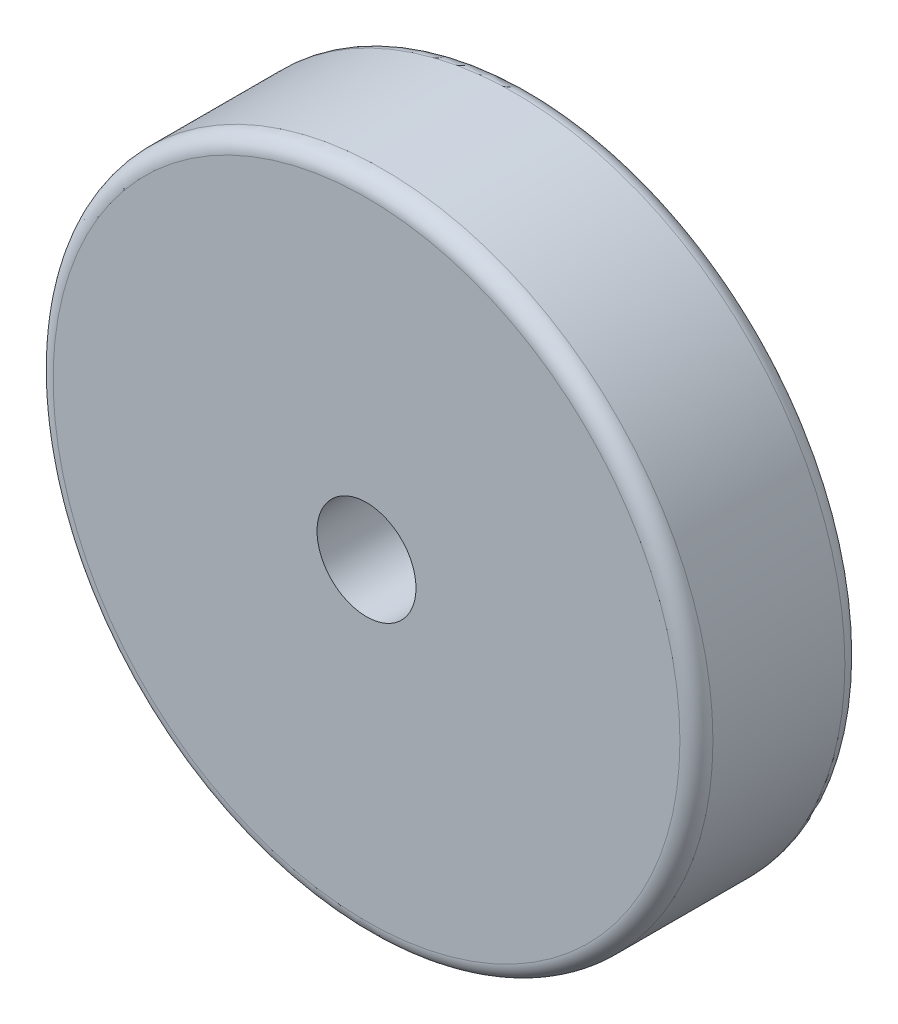
ISO-10303-21;
HEADER;
FILE_DESCRIPTION(('STEP AP214'),'2;1');
FILE_NAME('part.step','',(''),(''),'','','');
FILE_SCHEMA(('AUTOMOTIVE_DESIGN { 1 0 10303 214 1 1 1 1 }'));
ENDSEC;
DATA;
#1=APPLICATION_CONTEXT('core data for automotive mechanical design processes');
#2=APPLICATION_PROTOCOL_DEFINITION('international standard','automotive_design',2000,#1);
#3=PRODUCT_CONTEXT('',#1,'mechanical');
#4=PRODUCT('Part','Part','',(#3));
#5=PRODUCT_RELATED_PRODUCT_CATEGORY('part','',(#4));
#6=PRODUCT_DEFINITION_FORMATION('','',#4);
#7=PRODUCT_DEFINITION_CONTEXT('part definition',#1,'design');
#8=PRODUCT_DEFINITION('design','',#6,#7);
#9=PRODUCT_DEFINITION_SHAPE('','',#8);
#10=(LENGTH_UNIT() NAMED_UNIT(*) SI_UNIT(.MILLI.,.METRE.));
#11=(NAMED_UNIT(*) PLANE_ANGLE_UNIT() SI_UNIT($,.RADIAN.));
#12=(NAMED_UNIT(*) SI_UNIT($,.STERADIAN.) SOLID_ANGLE_UNIT());
#13=UNCERTAINTY_MEASURE_WITH_UNIT(LENGTH_MEASURE(1.E-05),#10,'distance_accuracy_value','');
#14=(GEOMETRIC_REPRESENTATION_CONTEXT(3) GLOBAL_UNCERTAINTY_ASSIGNED_CONTEXT((#13)) GLOBAL_UNIT_ASSIGNED_CONTEXT((#10,
#11,#12)) REPRESENTATION_CONTEXT('',''));
#15=CARTESIAN_POINT('',(0.,0.,0.));
#16=DIRECTION('',(0.,0.,1.));
#17=DIRECTION('',(1.,0.,0.));
#18=AXIS2_PLACEMENT_3D('',#15,#16,#17);
#19=CARTESIAN_POINT('',(0.,0.,10.));
#20=DIRECTION('',(0.,0.,1.));
#21=DIRECTION('',(1.,0.,0.));
#22=AXIS2_PLACEMENT_3D('',#19,#20,#21);
#23=PLANE('',#22);
#24=CARTESIAN_POINT('',(0.,0.,10.));
#25=DIRECTION('',(0.,0.,1.));
#26=DIRECTION('',(1.,0.,0.));
#27=AXIS2_PLACEMENT_3D('',#24,#25,#26);
#28=CIRCLE('',#27,19.);
#29=CARTESIAN_POINT('',(19.,0.,10.));
#30=VERTEX_POINT('',#29);
#31=EDGE_CURVE('E10',#30,#30,#28,.T.);
#32=ORIENTED_EDGE('',*,*,#31,.T.);
#33=EDGE_LOOP('',(#32));
#34=FACE_BOUND('',#33,.T.);
#35=CARTESIAN_POINT('',(0.,0.,10.));
#36=DIRECTION('',(0.,0.,1.));
#37=DIRECTION('',(1.,0.,0.));
#38=AXIS2_PLACEMENT_3D('',#35,#36,#37);
#39=CIRCLE('',#38,3.);
#40=CARTESIAN_POINT('',(3.,0.,10.));
#41=VERTEX_POINT('',#40);
#42=EDGE_CURVE('E61',#41,#41,#39,.T.);
#43=ORIENTED_EDGE('',*,*,#42,.F.);
#44=EDGE_LOOP('',(#43));
#45=FACE_BOUND('',#44,.T.);
#46=ADVANCED_FACE('F37',(#34,#45),#23,.T.);
#47=CARTESIAN_POINT('',(0.,0.,0.));
#48=DIRECTION('',(0.,0.,1.));
#49=DIRECTION('',(1.,0.,0.));
#50=AXIS2_PLACEMENT_3D('',#47,#48,#49);
#51=PLANE('',#50);
#52=CARTESIAN_POINT('',(0.,0.,0.));
#53=DIRECTION('',(0.,0.,1.));
#54=DIRECTION('',(1.,0.,0.));
#55=AXIS2_PLACEMENT_3D('',#52,#53,#54);
#56=CIRCLE('',#55,19.);
#57=CARTESIAN_POINT('',(19.,0.,0.));
#58=VERTEX_POINT('',#57);
#59=EDGE_CURVE('E45',#58,#58,#56,.F.);
#60=ORIENTED_EDGE('',*,*,#59,.T.);
#61=EDGE_LOOP('',(#60));
#62=FACE_BOUND('',#61,.T.);
#63=CARTESIAN_POINT('',(0.,0.,0.));
#64=DIRECTION('',(0.,0.,1.));
#65=DIRECTION('',(1.,0.,0.));
#66=AXIS2_PLACEMENT_3D('',#63,#64,#65);
#67=CIRCLE('',#66,3.);
#68=CARTESIAN_POINT('',(3.,0.,0.));
#69=VERTEX_POINT('',#68);
#70=EDGE_CURVE('E62',#69,#69,#67,.T.);
#71=ORIENTED_EDGE('',*,*,#70,.T.);
#72=EDGE_LOOP('',(#71));
#73=FACE_BOUND('',#72,.T.);
#74=ADVANCED_FACE('F74',(#62,#73),#51,.F.);
#75=CARTESIAN_POINT('',(0.,0.,10.));
#76=DIRECTION('',(0.,0.,-1.));
#77=DIRECTION('',(-1.,0.,0.));
#78=AXIS2_PLACEMENT_3D('',#75,#76,#77);
#79=CYLINDRICAL_SURFACE('',#78,20.);
#80=CARTESIAN_POINT('',(0.,0.,0.999999999999999));
#81=DIRECTION('',(0.,0.,1.));
#82=DIRECTION('',(1.,0.,0.));
#83=AXIS2_PLACEMENT_3D('',#80,#81,#82);
#84=CIRCLE('',#83,20.);
#85=CARTESIAN_POINT('',(20.,0.,0.999999999999999));
#86=VERTEX_POINT('',#85);
#87=EDGE_CURVE('E50',#86,#86,#84,.T.);
#88=ORIENTED_EDGE('',*,*,#87,.T.);
#89=EDGE_LOOP('',(#88));
#90=FACE_BOUND('',#89,.T.);
#91=CARTESIAN_POINT('',(0.,0.,9.));
#92=DIRECTION('',(0.,0.,1.));
#93=DIRECTION('',(1.,0.,0.));
#94=AXIS2_PLACEMENT_3D('',#91,#92,#93);
#95=CIRCLE('',#94,20.);
#96=CARTESIAN_POINT('',(20.,0.,9.));
#97=VERTEX_POINT('',#96);
#98=EDGE_CURVE('E55',#97,#97,#95,.F.);
#99=ORIENTED_EDGE('',*,*,#98,.T.);
#100=EDGE_LOOP('',(#99));
#101=FACE_BOUND('',#100,.T.);
#102=ADVANCED_FACE('F79',(#90,#101),#79,.T.);
#103=CARTESIAN_POINT('',(0.,0.,10.));
#104=DIRECTION('',(0.,0.,-1.));
#105=DIRECTION('',(-1.,0.,0.));
#106=AXIS2_PLACEMENT_3D('',#103,#104,#105);
#107=CYLINDRICAL_SURFACE('',#106,3.);
#108=ORIENTED_EDGE('',*,*,#42,.T.);
#109=EDGE_LOOP('',(#108));
#110=FACE_BOUND('',#109,.T.);
#111=ORIENTED_EDGE('',*,*,#70,.F.);
#112=EDGE_LOOP('',(#111));
#113=FACE_BOUND('',#112,.T.);
#114=ADVANCED_FACE('F70',(#110,#113),#107,.F.);
#115=CARTESIAN_POINT('',(0.,0.,0.999999999999999));
#116=DIRECTION('',(0.,0.,1.));
#117=DIRECTION('',(1.,0.,0.));
#118=AXIS2_PLACEMENT_3D('',#115,#116,#117);
#119=TOROIDAL_SURFACE('',#118,19.,1.);
#120=ORIENTED_EDGE('',*,*,#59,.F.);
#121=EDGE_LOOP('',(#120));
#122=FACE_BOUND('',#121,.T.);
#123=ORIENTED_EDGE('',*,*,#87,.F.);
#124=EDGE_LOOP('',(#123));
#125=FACE_BOUND('',#124,.T.);
#126=ADVANCED_FACE('F85',(#122,#125),#119,.T.);
#127=CARTESIAN_POINT('',(0.,0.,9.));
#128=DIRECTION('',(0.,0.,1.));
#129=DIRECTION('',(1.,0.,0.));
#130=AXIS2_PLACEMENT_3D('',#127,#128,#129);
#131=TOROIDAL_SURFACE('',#130,19.,1.);
#132=ORIENTED_EDGE('',*,*,#98,.F.);
#133=EDGE_LOOP('',(#132));
#134=FACE_BOUND('',#133,.T.);
#135=ORIENTED_EDGE('',*,*,#31,.F.);
#136=EDGE_LOOP('',(#135));
#137=FACE_BOUND('',#136,.T.);
#138=ADVANCED_FACE('F39',(#134,#137),#131,.T.);
#139=CLOSED_SHELL('',(#46,#74,#102,#114,#126,#138));
#140=MANIFOLD_SOLID_BREP('B2',#139);
#141=ADVANCED_BREP_SHAPE_REPRESENTATION('',(#18,#140),#14);
#142=SHAPE_DEFINITION_REPRESENTATION(#9,#141);
ENDSEC;
END-ISO-10303-21;
